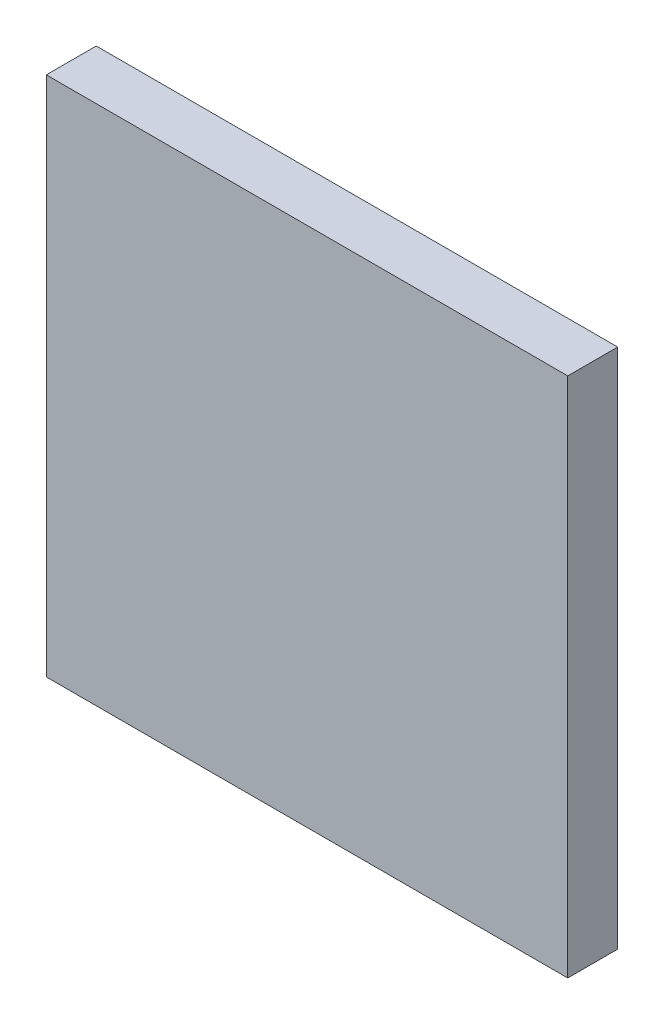
ISO-10303-21;
HEADER;
FILE_DESCRIPTION(('STEP AP214'),'2;1');
FILE_NAME('part.step','',(''),(''),'','','');
FILE_SCHEMA(('AUTOMOTIVE_DESIGN { 1 0 10303 214 1 1 1 1 }'));
ENDSEC;
DATA;
#1=APPLICATION_CONTEXT('core data for automotive mechanical design processes');
#2=APPLICATION_PROTOCOL_DEFINITION('international standard','automotive_design',2000,#1);
#3=PRODUCT_CONTEXT('',#1,'mechanical');
#4=PRODUCT('Part','Part','',(#3));
#5=PRODUCT_RELATED_PRODUCT_CATEGORY('part','',(#4));
#6=PRODUCT_DEFINITION_FORMATION('','',#4);
#7=PRODUCT_DEFINITION_CONTEXT('part definition',#1,'design');
#8=PRODUCT_DEFINITION('design','',#6,#7);
#9=PRODUCT_DEFINITION_SHAPE('','',#8);
#10=(LENGTH_UNIT() NAMED_UNIT(*) SI_UNIT(.MILLI.,.METRE.));
#11=(NAMED_UNIT(*) PLANE_ANGLE_UNIT() SI_UNIT($,.RADIAN.));
#12=(NAMED_UNIT(*) SI_UNIT($,.STERADIAN.) SOLID_ANGLE_UNIT());
#13=UNCERTAINTY_MEASURE_WITH_UNIT(LENGTH_MEASURE(1.E-05),#10,'distance_accuracy_value','');
#14=(GEOMETRIC_REPRESENTATION_CONTEXT(3) GLOBAL_UNCERTAINTY_ASSIGNED_CONTEXT((#13)) GLOBAL_UNIT_ASSIGNED_CONTEXT((#10,
#11,#12)) REPRESENTATION_CONTEXT('',''));
#15=CARTESIAN_POINT('',(0.,0.,0.));
#16=DIRECTION('',(0.,0.,1.));
#17=DIRECTION('',(1.,0.,0.));
#18=AXIS2_PLACEMENT_3D('',#15,#16,#17);
#19=CARTESIAN_POINT('',(-0.225975,0.22598,0.8));
#20=DIRECTION('',(0.,0.,1.));
#21=DIRECTION('',(1.,0.,0.));
#22=AXIS2_PLACEMENT_3D('',#19,#20,#21);
#23=PLANE('',#22);
#24=DIRECTION('',(1.,0.,0.));
#25=VECTOR('',#24,1.);
#26=CARTESIAN_POINT('',(-4.40195,-3.95,0.8));
#27=LINE('',#26,#25);
#28=CARTESIAN_POINT('',(-4.40195,-3.95,0.8));
#29=VERTEX_POINT('',#28);
#30=CARTESIAN_POINT('',(3.95,-3.95,0.8));
#31=VERTEX_POINT('',#30);
#32=EDGE_CURVE('E82',#29,#31,#27,.T.);
#33=ORIENTED_EDGE('',*,*,#32,.T.);
#34=DIRECTION('',(0.,1.,0.));
#35=VECTOR('',#34,1.);
#36=CARTESIAN_POINT('',(3.95,-3.95,0.8));
#37=LINE('',#36,#35);
#38=CARTESIAN_POINT('',(3.95,4.40196,0.8));
#39=VERTEX_POINT('',#38);
#40=EDGE_CURVE('E68',#31,#39,#37,.T.);
#41=ORIENTED_EDGE('',*,*,#40,.T.);
#42=DIRECTION('',(-1.,0.,0.));
#43=VECTOR('',#42,1.);
#44=CARTESIAN_POINT('',(3.95,4.40196,0.8));
#45=LINE('',#44,#43);
#46=CARTESIAN_POINT('',(-4.40195,4.40196,0.8));
#47=VERTEX_POINT('',#46);
#48=EDGE_CURVE('E99',#39,#47,#45,.T.);
#49=ORIENTED_EDGE('',*,*,#48,.T.);
#50=DIRECTION('',(0.,-1.,0.));
#51=VECTOR('',#50,1.);
#52=CARTESIAN_POINT('',(-4.40195,4.40196,0.8));
#53=LINE('',#52,#51);
#54=EDGE_CURVE('E11',#47,#29,#53,.T.);
#55=ORIENTED_EDGE('',*,*,#54,.T.);
#56=EDGE_LOOP('',(#33,#41,#49,#55));
#57=FACE_BOUND('',#56,.T.);
#58=ADVANCED_FACE('F16',(#57),#23,.T.);
#59=CARTESIAN_POINT('',(-0.225975,0.22598,0.));
#60=DIRECTION('',(0.,0.,1.));
#61=DIRECTION('',(1.,0.,0.));
#62=AXIS2_PLACEMENT_3D('',#59,#60,#61);
#63=PLANE('',#62);
#64=DIRECTION('',(1.,0.,0.));
#65=VECTOR('',#64,1.);
#66=CARTESIAN_POINT('',(-4.40195,-3.95,0.));
#67=LINE('',#66,#65);
#68=CARTESIAN_POINT('',(-4.40195,-3.95,0.));
#69=VERTEX_POINT('',#68);
#70=CARTESIAN_POINT('',(3.95,-3.95,0.));
#71=VERTEX_POINT('',#70);
#72=EDGE_CURVE('E90',#69,#71,#67,.T.);
#73=ORIENTED_EDGE('',*,*,#72,.F.);
#74=DIRECTION('',(0.,-1.,0.));
#75=VECTOR('',#74,1.);
#76=CARTESIAN_POINT('',(-4.40195,4.40196,0.));
#77=LINE('',#76,#75);
#78=CARTESIAN_POINT('',(-4.40195,4.40196,0.));
#79=VERTEX_POINT('',#78);
#80=EDGE_CURVE('E27',#79,#69,#77,.T.);
#81=ORIENTED_EDGE('',*,*,#80,.F.);
#82=DIRECTION('',(-1.,0.,0.));
#83=VECTOR('',#82,1.);
#84=CARTESIAN_POINT('',(3.95,4.40196,0.));
#85=LINE('',#84,#83);
#86=CARTESIAN_POINT('',(3.95,4.40196,0.));
#87=VERTEX_POINT('',#86);
#88=EDGE_CURVE('E79',#87,#79,#85,.T.);
#89=ORIENTED_EDGE('',*,*,#88,.F.);
#90=DIRECTION('',(0.,1.,0.));
#91=VECTOR('',#90,1.);
#92=CARTESIAN_POINT('',(3.95,-3.95,0.));
#93=LINE('',#92,#91);
#94=EDGE_CURVE('E86',#71,#87,#93,.T.);
#95=ORIENTED_EDGE('',*,*,#94,.F.);
#96=EDGE_LOOP('',(#73,#81,#89,#95));
#97=FACE_BOUND('',#96,.T.);
#98=ADVANCED_FACE('F110',(#97),#63,.F.);
#99=CARTESIAN_POINT('',(-4.40195,4.40196,0.));
#100=DIRECTION('',(1.,0.,0.));
#101=DIRECTION('',(0.,1.,0.));
#102=AXIS2_PLACEMENT_3D('',#99,#100,#101);
#103=PLANE('',#102);
#104=DIRECTION('',(0.,0.,1.));
#105=VECTOR('',#104,1.);
#106=CARTESIAN_POINT('',(-4.40195,4.40196,0.));
#107=LINE('',#106,#105);
#108=EDGE_CURVE('E20',#79,#47,#107,.T.);
#109=ORIENTED_EDGE('',*,*,#108,.F.);
#110=ORIENTED_EDGE('',*,*,#80,.T.);
#111=DIRECTION('',(0.,0.,1.));
#112=VECTOR('',#111,1.);
#113=CARTESIAN_POINT('',(-4.40195,-3.95,0.));
#114=LINE('',#113,#112);
#115=EDGE_CURVE('E96',#69,#29,#114,.T.);
#116=ORIENTED_EDGE('',*,*,#115,.T.);
#117=ORIENTED_EDGE('',*,*,#54,.F.);
#118=EDGE_LOOP('',(#109,#110,#116,#117));
#119=FACE_BOUND('',#118,.T.);
#120=ADVANCED_FACE('F18',(#119),#103,.F.);
#121=CARTESIAN_POINT('',(3.95,4.40196,0.));
#122=DIRECTION('',(0.,-1.,0.));
#123=DIRECTION('',(0.,0.,-1.));
#124=AXIS2_PLACEMENT_3D('',#121,#122,#123);
#125=PLANE('',#124);
#126=DIRECTION('',(0.,0.,1.));
#127=VECTOR('',#126,1.);
#128=CARTESIAN_POINT('',(3.95,4.40196,0.));
#129=LINE('',#128,#127);
#130=EDGE_CURVE('E76',#87,#39,#129,.T.);
#131=ORIENTED_EDGE('',*,*,#130,.F.);
#132=ORIENTED_EDGE('',*,*,#88,.T.);
#133=ORIENTED_EDGE('',*,*,#108,.T.);
#134=ORIENTED_EDGE('',*,*,#48,.F.);
#135=EDGE_LOOP('',(#131,#132,#133,#134));
#136=FACE_BOUND('',#135,.T.);
#137=ADVANCED_FACE('F114',(#136),#125,.F.);
#138=CARTESIAN_POINT('',(3.95,-3.95,0.));
#139=DIRECTION('',(-1.,0.,0.));
#140=DIRECTION('',(0.,0.,1.));
#141=AXIS2_PLACEMENT_3D('',#138,#139,#140);
#142=PLANE('',#141);
#143=DIRECTION('',(0.,0.,1.));
#144=VECTOR('',#143,1.);
#145=CARTESIAN_POINT('',(3.95,-3.95,0.));
#146=LINE('',#145,#144);
#147=EDGE_CURVE('E73',#71,#31,#146,.T.);
#148=ORIENTED_EDGE('',*,*,#147,.F.);
#149=ORIENTED_EDGE('',*,*,#94,.T.);
#150=ORIENTED_EDGE('',*,*,#130,.T.);
#151=ORIENTED_EDGE('',*,*,#40,.F.);
#152=EDGE_LOOP('',(#148,#149,#150,#151));
#153=FACE_BOUND('',#152,.T.);
#154=ADVANCED_FACE('F70',(#153),#142,.F.);
#155=CARTESIAN_POINT('',(-4.40195,-3.95,0.));
#156=DIRECTION('',(0.,1.,0.));
#157=DIRECTION('',(1.,0.,0.));
#158=AXIS2_PLACEMENT_3D('',#155,#156,#157);
#159=PLANE('',#158);
#160=ORIENTED_EDGE('',*,*,#115,.F.);
#161=ORIENTED_EDGE('',*,*,#72,.T.);
#162=ORIENTED_EDGE('',*,*,#147,.T.);
#163=ORIENTED_EDGE('',*,*,#32,.F.);
#164=EDGE_LOOP('',(#160,#161,#162,#163));
#165=FACE_BOUND('',#164,.T.);
#166=ADVANCED_FACE('F88',(#165),#159,.F.);
#167=CLOSED_SHELL('',(#58,#98,#120,#137,#154,#166));
#168=MANIFOLD_SOLID_BREP('B1',#167);
#169=ADVANCED_BREP_SHAPE_REPRESENTATION('',(#18,#168),#14);
#170=SHAPE_DEFINITION_REPRESENTATION(#9,#169);
ENDSEC;
END-ISO-10303-21;
